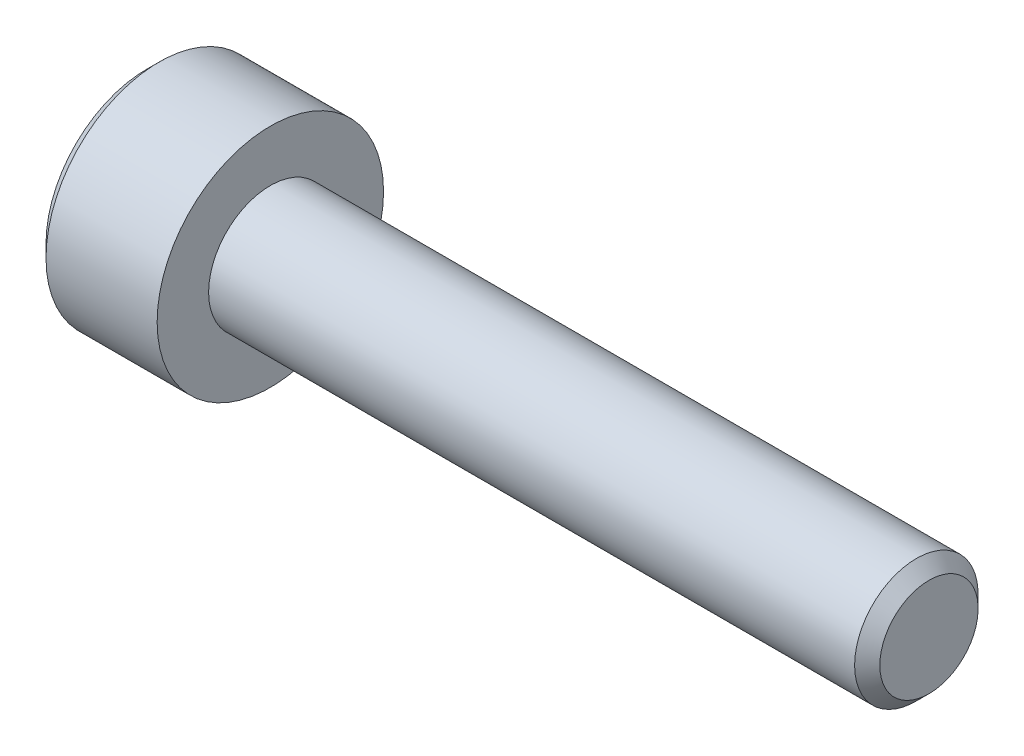
ISO-10303-21;
HEADER;
FILE_DESCRIPTION(('STEP AP214'),'2;1');
FILE_NAME('part.step','',(''),(''),'','','');
FILE_SCHEMA(('AUTOMOTIVE_DESIGN { 1 0 10303 214 1 1 1 1 }'));
ENDSEC;
DATA;
#1=APPLICATION_CONTEXT('core data for automotive mechanical design processes');
#2=APPLICATION_PROTOCOL_DEFINITION('international standard','automotive_design',2000,#1);
#3=PRODUCT_CONTEXT('',#1,'mechanical');
#4=PRODUCT('Part','Part','',(#3));
#5=PRODUCT_RELATED_PRODUCT_CATEGORY('part','',(#4));
#6=PRODUCT_DEFINITION_FORMATION('','',#4);
#7=PRODUCT_DEFINITION_CONTEXT('part definition',#1,'design');
#8=PRODUCT_DEFINITION('design','',#6,#7);
#9=PRODUCT_DEFINITION_SHAPE('','',#8);
#10=(LENGTH_UNIT() NAMED_UNIT(*) SI_UNIT(.MILLI.,.METRE.));
#11=(NAMED_UNIT(*) PLANE_ANGLE_UNIT() SI_UNIT($,.RADIAN.));
#12=(NAMED_UNIT(*) SI_UNIT($,.STERADIAN.) SOLID_ANGLE_UNIT());
#13=UNCERTAINTY_MEASURE_WITH_UNIT(LENGTH_MEASURE(1.E-05),#10,'distance_accuracy_value','');
#14=(GEOMETRIC_REPRESENTATION_CONTEXT(3) GLOBAL_UNCERTAINTY_ASSIGNED_CONTEXT((#13)) GLOBAL_UNIT_ASSIGNED_CONTEXT((#10,
#11,#12)) REPRESENTATION_CONTEXT('',''));
#15=CARTESIAN_POINT('',(0.,0.,0.));
#16=DIRECTION('',(0.,0.,1.));
#17=DIRECTION('',(1.,0.,0.));
#18=AXIS2_PLACEMENT_3D('',#15,#16,#17);
#19=CARTESIAN_POINT('',(-3.,-2.45000000000001,0.));
#20=DIRECTION('',(-1.,0.,0.));
#21=DIRECTION('',(0.,0.,1.));
#22=AXIS2_PLACEMENT_3D('',#19,#20,#21);
#23=PLANE('',#22);
#24=DIRECTION('',(0.,0.5,-0.866025403784439));
#25=VECTOR('',#24,1.);
#26=CARTESIAN_POINT('',(-3.,0.721687836487033,1.25));
#27=LINE('',#26,#25);
#28=CARTESIAN_POINT('',(-3.,0.721687836487033,1.25));
#29=VERTEX_POINT('',#28);
#30=CARTESIAN_POINT('',(-3.,1.44337567297406,0.));
#31=VERTEX_POINT('',#30);
#32=EDGE_CURVE('E59',#29,#31,#27,.T.);
#33=ORIENTED_EDGE('',*,*,#32,.F.);
#34=DIRECTION('',(0.,1.,0.));
#35=VECTOR('',#34,1.);
#36=CARTESIAN_POINT('',(-3.,-0.721687836487033,1.25));
#37=LINE('',#36,#35);
#38=CARTESIAN_POINT('',(-3.,-0.721687836487033,1.25));
#39=VERTEX_POINT('',#38);
#40=EDGE_CURVE('E142',#39,#29,#37,.T.);
#41=ORIENTED_EDGE('',*,*,#40,.F.);
#42=DIRECTION('',(0.,0.5,0.866025403784439));
#43=VECTOR('',#42,1.);
#44=CARTESIAN_POINT('',(-3.,-1.44337567297406,0.));
#45=LINE('',#44,#43);
#46=CARTESIAN_POINT('',(-3.,-1.44337567297406,0.));
#47=VERTEX_POINT('',#46);
#48=EDGE_CURVE('E140',#47,#39,#45,.T.);
#49=ORIENTED_EDGE('',*,*,#48,.F.);
#50=DIRECTION('',(0.,-0.5,0.866025403784439));
#51=VECTOR('',#50,1.);
#52=CARTESIAN_POINT('',(-3.,-0.721687836487032,-1.25));
#53=LINE('',#52,#51);
#54=CARTESIAN_POINT('',(-3.,-0.721687836487032,-1.25));
#55=VERTEX_POINT('',#54);
#56=EDGE_CURVE('E107',#55,#47,#53,.T.);
#57=ORIENTED_EDGE('',*,*,#56,.F.);
#58=DIRECTION('',(0.,-1.,0.));
#59=VECTOR('',#58,1.);
#60=CARTESIAN_POINT('',(-3.,0.721687836487033,-1.25));
#61=LINE('',#60,#59);
#62=CARTESIAN_POINT('',(-3.,0.721687836487033,-1.25));
#63=VERTEX_POINT('',#62);
#64=EDGE_CURVE('E136',#63,#55,#61,.T.);
#65=ORIENTED_EDGE('',*,*,#64,.F.);
#66=DIRECTION('',(0.,-0.5,-0.866025403784439));
#67=VECTOR('',#66,1.);
#68=CARTESIAN_POINT('',(-3.,1.44337567297406,0.));
#69=LINE('',#68,#67);
#70=EDGE_CURVE('E133',#31,#63,#69,.T.);
#71=ORIENTED_EDGE('',*,*,#70,.F.);
#72=EDGE_LOOP('',(#33,#41,#49,#57,#65,#71));
#73=FACE_BOUND('',#72,.T.);
#74=CARTESIAN_POINT('',(-3.,0.,0.));
#75=DIRECTION('',(-1.,0.,0.));
#76=DIRECTION('',(0.,0.,1.));
#77=AXIS2_PLACEMENT_3D('',#74,#75,#76);
#78=CIRCLE('',#77,2.45000000000001);
#79=CARTESIAN_POINT('',(-3.,0.,2.45000000000001));
#80=VERTEX_POINT('',#79);
#81=EDGE_CURVE('E146',#80,#80,#78,.T.);
#82=ORIENTED_EDGE('',*,*,#81,.T.);
#83=EDGE_LOOP('',(#82));
#84=FACE_BOUND('',#83,.T.);
#85=ADVANCED_FACE('F45',(#73,#84),#23,.T.);
#86=CARTESIAN_POINT('',(16.,0.,0.));
#87=DIRECTION('',(1.,0.,0.));
#88=DIRECTION('',(0.,0.,-1.));
#89=AXIS2_PLACEMENT_3D('',#86,#87,#88);
#90=PLANE('',#89);
#91=CARTESIAN_POINT('',(16.,0.,0.));
#92=DIRECTION('',(-1.,0.,0.));
#93=DIRECTION('',(0.,0.,1.));
#94=AXIS2_PLACEMENT_3D('',#91,#92,#93);
#95=CIRCLE('',#94,1.1935);
#96=CARTESIAN_POINT('',(16.,0.,1.1935));
#97=VERTEX_POINT('',#96);
#98=EDGE_CURVE('E11',#97,#97,#95,.T.);
#99=ORIENTED_EDGE('',*,*,#98,.F.);
#100=EDGE_LOOP('',(#99));
#101=FACE_BOUND('',#100,.T.);
#102=ADVANCED_FACE('F170',(#101),#90,.T.);
#103=CARTESIAN_POINT('',(15.6935,0.,0.));
#104=DIRECTION('',(-1.,0.,0.));
#105=DIRECTION('',(0.,0.,1.));
#106=AXIS2_PLACEMENT_3D('',#103,#104,#105);
#107=CONICAL_SURFACE('',#106,1.5,0.785398163397458);
#108=ORIENTED_EDGE('',*,*,#98,.T.);
#109=EDGE_LOOP('',(#108));
#110=FACE_BOUND('',#109,.T.);
#111=CARTESIAN_POINT('',(15.6935,0.,0.));
#112=DIRECTION('',(-1.,0.,0.));
#113=DIRECTION('',(0.,0.,1.));
#114=AXIS2_PLACEMENT_3D('',#111,#112,#113);
#115=CIRCLE('',#114,1.5);
#116=CARTESIAN_POINT('',(15.6935,0.,1.5));
#117=VERTEX_POINT('',#116);
#118=EDGE_CURVE('E52',#117,#117,#115,.T.);
#119=ORIENTED_EDGE('',*,*,#118,.F.);
#120=EDGE_LOOP('',(#119));
#121=FACE_BOUND('',#120,.T.);
#122=ADVANCED_FACE('F168',(#110,#121),#107,.T.);
#123=CARTESIAN_POINT('',(-3.95,0.,0.));
#124=DIRECTION('',(-1.,0.,0.));
#125=DIRECTION('',(0.,0.,1.));
#126=AXIS2_PLACEMENT_3D('',#123,#124,#125);
#127=CYLINDRICAL_SURFACE('',#126,1.5);
#128=ORIENTED_EDGE('',*,*,#118,.T.);
#129=EDGE_LOOP('',(#128));
#130=FACE_BOUND('',#129,.T.);
#131=CARTESIAN_POINT('',(0.,0.,0.));
#132=DIRECTION('',(-1.,0.,0.));
#133=DIRECTION('',(0.,0.,1.));
#134=AXIS2_PLACEMENT_3D('',#131,#132,#133);
#135=CIRCLE('',#134,1.5);
#136=CARTESIAN_POINT('',(0.,0.,1.5));
#137=VERTEX_POINT('',#136);
#138=EDGE_CURVE('E160',#137,#137,#135,.T.);
#139=ORIENTED_EDGE('',*,*,#138,.F.);
#140=EDGE_LOOP('',(#139));
#141=FACE_BOUND('',#140,.T.);
#142=ADVANCED_FACE('F165',(#130,#141),#127,.T.);
#143=CARTESIAN_POINT('',(0.,-1.5,0.));
#144=DIRECTION('',(1.,0.,0.));
#145=DIRECTION('',(0.,0.,-1.));
#146=AXIS2_PLACEMENT_3D('',#143,#144,#145);
#147=PLANE('',#146);
#148=ORIENTED_EDGE('',*,*,#138,.T.);
#149=EDGE_LOOP('',(#148));
#150=FACE_BOUND('',#149,.T.);
#151=CARTESIAN_POINT('',(0.,0.,0.));
#152=DIRECTION('',(-1.,0.,0.));
#153=DIRECTION('',(0.,0.,1.));
#154=AXIS2_PLACEMENT_3D('',#151,#152,#153);
#155=CIRCLE('',#154,2.75);
#156=CARTESIAN_POINT('',(0.,0.,2.75));
#157=VERTEX_POINT('',#156);
#158=EDGE_CURVE('E157',#157,#157,#155,.T.);
#159=ORIENTED_EDGE('',*,*,#158,.F.);
#160=EDGE_LOOP('',(#159));
#161=FACE_BOUND('',#160,.T.);
#162=ADVANCED_FACE('F178',(#150,#161),#147,.T.);
#163=CARTESIAN_POINT('',(-3.95,0.,0.));
#164=DIRECTION('',(-1.,0.,0.));
#165=DIRECTION('',(0.,0.,1.));
#166=AXIS2_PLACEMENT_3D('',#163,#164,#165);
#167=CYLINDRICAL_SURFACE('',#166,2.75);
#168=ORIENTED_EDGE('',*,*,#158,.T.);
#169=EDGE_LOOP('',(#168));
#170=FACE_BOUND('',#169,.T.);
#171=CARTESIAN_POINT('',(-2.7,0.,0.));
#172=DIRECTION('',(-1.,0.,0.));
#173=DIRECTION('',(0.,0.,1.));
#174=AXIS2_PLACEMENT_3D('',#171,#172,#173);
#175=CIRCLE('',#174,2.75);
#176=CARTESIAN_POINT('',(-2.7,0.,2.75));
#177=VERTEX_POINT('',#176);
#178=EDGE_CURVE('E154',#177,#177,#175,.T.);
#179=ORIENTED_EDGE('',*,*,#178,.F.);
#180=EDGE_LOOP('',(#179));
#181=FACE_BOUND('',#180,.T.);
#182=ADVANCED_FACE('F194',(#170,#181),#167,.T.);
#183=CARTESIAN_POINT('',(-3.,0.,0.));
#184=DIRECTION('',(1.,0.,0.));
#185=DIRECTION('',(0.,0.,-1.));
#186=AXIS2_PLACEMENT_3D('',#183,#184,#185);
#187=CONICAL_SURFACE('',#186,2.45000000000001,0.785398163397443);
#188=ORIENTED_EDGE('',*,*,#178,.T.);
#189=EDGE_LOOP('',(#188));
#190=FACE_BOUND('',#189,.T.);
#191=ORIENTED_EDGE('',*,*,#81,.F.);
#192=EDGE_LOOP('',(#191));
#193=FACE_BOUND('',#192,.T.);
#194=ADVANCED_FACE('F192',(#190,#193),#187,.T.);
#195=CARTESIAN_POINT('',(-1.5,0.721687836487033,1.25));
#196=DIRECTION('',(0.,0.866025403784439,0.5));
#197=DIRECTION('',(0.,-0.5,0.866025403784439));
#198=AXIS2_PLACEMENT_3D('',#195,#196,#197);
#199=PLANE('',#198);
#200=ORIENTED_EDGE('',*,*,#32,.T.);
#201=DIRECTION('',(-1.,0.,0.));
#202=VECTOR('',#201,1.);
#203=CARTESIAN_POINT('',(-1.5,1.44337567297406,0.));
#204=LINE('',#203,#202);
#205=CARTESIAN_POINT('',(-1.5,1.44337567297406,0.));
#206=VERTEX_POINT('',#205);
#207=EDGE_CURVE('E89',#206,#31,#204,.T.);
#208=ORIENTED_EDGE('',*,*,#207,.F.);
#209=DIRECTION('',(0.,0.5,-0.866025403784439));
#210=VECTOR('',#209,1.);
#211=CARTESIAN_POINT('',(-1.5,0.721687836487033,1.25));
#212=LINE('',#211,#210);
#213=CARTESIAN_POINT('',(-1.5,0.721687836487033,1.25));
#214=VERTEX_POINT('',#213);
#215=EDGE_CURVE('E144',#214,#206,#212,.T.);
#216=ORIENTED_EDGE('',*,*,#215,.F.);
#217=DIRECTION('',(-1.,0.,0.));
#218=VECTOR('',#217,1.);
#219=CARTESIAN_POINT('',(-1.5,0.721687836487033,1.25));
#220=LINE('',#219,#218);
#221=EDGE_CURVE('E67',#214,#29,#220,.T.);
#222=ORIENTED_EDGE('',*,*,#221,.T.);
#223=EDGE_LOOP('',(#200,#208,#216,#222));
#224=FACE_BOUND('',#223,.T.);
#225=ADVANCED_FACE('F193',(#224),#199,.F.);
#226=CARTESIAN_POINT('',(-1.5,-0.721687836487033,1.25));
#227=DIRECTION('',(0.,0.,1.));
#228=DIRECTION('',(0.,-1.,0.));
#229=AXIS2_PLACEMENT_3D('',#226,#227,#228);
#230=PLANE('',#229);
#231=ORIENTED_EDGE('',*,*,#40,.T.);
#232=ORIENTED_EDGE('',*,*,#221,.F.);
#233=DIRECTION('',(0.,1.,0.));
#234=VECTOR('',#233,1.);
#235=CARTESIAN_POINT('',(-1.5,-0.721687836487033,1.25));
#236=LINE('',#235,#234);
#237=CARTESIAN_POINT('',(-1.5,-0.721687836487033,1.25));
#238=VERTEX_POINT('',#237);
#239=EDGE_CURVE('E119',#238,#214,#236,.T.);
#240=ORIENTED_EDGE('',*,*,#239,.F.);
#241=DIRECTION('',(-1.,0.,0.));
#242=VECTOR('',#241,1.);
#243=CARTESIAN_POINT('',(-1.5,-0.721687836487033,1.25));
#244=LINE('',#243,#242);
#245=EDGE_CURVE('E111',#238,#39,#244,.T.);
#246=ORIENTED_EDGE('',*,*,#245,.T.);
#247=EDGE_LOOP('',(#231,#232,#240,#246));
#248=FACE_BOUND('',#247,.T.);
#249=ADVANCED_FACE('F200',(#248),#230,.F.);
#250=CARTESIAN_POINT('',(-1.5,-1.44337567297406,0.));
#251=DIRECTION('',(0.,-0.866025403784439,0.5));
#252=DIRECTION('',(0.,-0.5,-0.866025403784439));
#253=AXIS2_PLACEMENT_3D('',#250,#251,#252);
#254=PLANE('',#253);
#255=ORIENTED_EDGE('',*,*,#48,.T.);
#256=ORIENTED_EDGE('',*,*,#245,.F.);
#257=DIRECTION('',(0.,0.5,0.866025403784439));
#258=VECTOR('',#257,1.);
#259=CARTESIAN_POINT('',(-1.5,-1.44337567297406,0.));
#260=LINE('',#259,#258);
#261=CARTESIAN_POINT('',(-1.5,-1.44337567297406,0.));
#262=VERTEX_POINT('',#261);
#263=EDGE_CURVE('E115',#262,#238,#260,.T.);
#264=ORIENTED_EDGE('',*,*,#263,.F.);
#265=DIRECTION('',(-1.,0.,0.));
#266=VECTOR('',#265,1.);
#267=CARTESIAN_POINT('',(-1.5,-1.44337567297406,0.));
#268=LINE('',#267,#266);
#269=EDGE_CURVE('E100',#262,#47,#268,.T.);
#270=ORIENTED_EDGE('',*,*,#269,.T.);
#271=EDGE_LOOP('',(#255,#256,#264,#270));
#272=FACE_BOUND('',#271,.T.);
#273=ADVANCED_FACE('F116',(#272),#254,.F.);
#274=CARTESIAN_POINT('',(-1.5,-0.721687836487032,-1.25));
#275=DIRECTION('',(0.,-0.866025403784438,-0.5));
#276=DIRECTION('',(0.,0.5,-0.866025403784439));
#277=AXIS2_PLACEMENT_3D('',#274,#275,#276);
#278=PLANE('',#277);
#279=ORIENTED_EDGE('',*,*,#56,.T.);
#280=ORIENTED_EDGE('',*,*,#269,.F.);
#281=DIRECTION('',(0.,-0.5,0.866025403784439));
#282=VECTOR('',#281,1.);
#283=CARTESIAN_POINT('',(-1.5,-0.721687836487032,-1.25));
#284=LINE('',#283,#282);
#285=CARTESIAN_POINT('',(-1.5,-0.721687836487032,-1.25));
#286=VERTEX_POINT('',#285);
#287=EDGE_CURVE('E104',#286,#262,#284,.T.);
#288=ORIENTED_EDGE('',*,*,#287,.F.);
#289=DIRECTION('',(-1.,0.,0.));
#290=VECTOR('',#289,1.);
#291=CARTESIAN_POINT('',(-1.5,-0.721687836487032,-1.25));
#292=LINE('',#291,#290);
#293=EDGE_CURVE('E112',#286,#55,#292,.T.);
#294=ORIENTED_EDGE('',*,*,#293,.T.);
#295=EDGE_LOOP('',(#279,#280,#288,#294));
#296=FACE_BOUND('',#295,.T.);
#297=ADVANCED_FACE('F102',(#296),#278,.F.);
#298=CARTESIAN_POINT('',(-1.5,0.721687836487033,-1.25));
#299=DIRECTION('',(0.,0.,-1.));
#300=DIRECTION('',(-1.,0.,0.));
#301=AXIS2_PLACEMENT_3D('',#298,#299,#300);
#302=PLANE('',#301);
#303=ORIENTED_EDGE('',*,*,#64,.T.);
#304=ORIENTED_EDGE('',*,*,#293,.F.);
#305=DIRECTION('',(0.,-1.,0.));
#306=VECTOR('',#305,1.);
#307=CARTESIAN_POINT('',(-1.5,0.721687836487033,-1.25));
#308=LINE('',#307,#306);
#309=CARTESIAN_POINT('',(-1.5,0.721687836487033,-1.25));
#310=VERTEX_POINT('',#309);
#311=EDGE_CURVE('E125',#310,#286,#308,.T.);
#312=ORIENTED_EDGE('',*,*,#311,.F.);
#313=DIRECTION('',(-1.,0.,0.));
#314=VECTOR('',#313,1.);
#315=CARTESIAN_POINT('',(-1.5,0.721687836487033,-1.25));
#316=LINE('',#315,#314);
#317=EDGE_CURVE('E149',#310,#63,#316,.T.);
#318=ORIENTED_EDGE('',*,*,#317,.T.);
#319=EDGE_LOOP('',(#303,#304,#312,#318));
#320=FACE_BOUND('',#319,.T.);
#321=ADVANCED_FACE('F259',(#320),#302,.F.);
#322=CARTESIAN_POINT('',(-1.5,1.44337567297406,0.));
#323=DIRECTION('',(0.,0.866025403784439,-0.5));
#324=DIRECTION('',(0.,0.5,0.866025403784439));
#325=AXIS2_PLACEMENT_3D('',#322,#323,#324);
#326=PLANE('',#325);
#327=ORIENTED_EDGE('',*,*,#70,.T.);
#328=ORIENTED_EDGE('',*,*,#317,.F.);
#329=DIRECTION('',(0.,-0.5,-0.866025403784439));
#330=VECTOR('',#329,1.);
#331=CARTESIAN_POINT('',(-1.5,1.44337567297406,0.));
#332=LINE('',#331,#330);
#333=EDGE_CURVE('E127',#206,#310,#332,.T.);
#334=ORIENTED_EDGE('',*,*,#333,.F.);
#335=ORIENTED_EDGE('',*,*,#207,.T.);
#336=EDGE_LOOP('',(#327,#328,#334,#335));
#337=FACE_BOUND('',#336,.T.);
#338=ADVANCED_FACE('F268',(#337),#326,.F.);
#339=CARTESIAN_POINT('',(-1.5,0.,0.));
#340=DIRECTION('',(-1.,0.,0.));
#341=DIRECTION('',(0.,0.,1.));
#342=AXIS2_PLACEMENT_3D('',#339,#340,#341);
#343=PLANE('',#342);
#344=ORIENTED_EDGE('',*,*,#215,.T.);
#345=ORIENTED_EDGE('',*,*,#333,.T.);
#346=ORIENTED_EDGE('',*,*,#311,.T.);
#347=ORIENTED_EDGE('',*,*,#287,.T.);
#348=ORIENTED_EDGE('',*,*,#263,.T.);
#349=ORIENTED_EDGE('',*,*,#239,.T.);
#350=EDGE_LOOP('',(#344,#345,#346,#347,#348,#349));
#351=FACE_BOUND('',#350,.T.);
#352=ADVANCED_FACE('F122',(#351),#343,.T.);
#353=CLOSED_SHELL('',(#85,#102,#122,#142,#162,#182,#194,#225,#249,#273,#297,#321,#338,#352));
#354=MANIFOLD_SOLID_BREP('B2',#353);
#355=ADVANCED_BREP_SHAPE_REPRESENTATION('',(#18,#354),#14);
#356=SHAPE_DEFINITION_REPRESENTATION(#9,#355);
ENDSEC;
END-ISO-10303-21;
